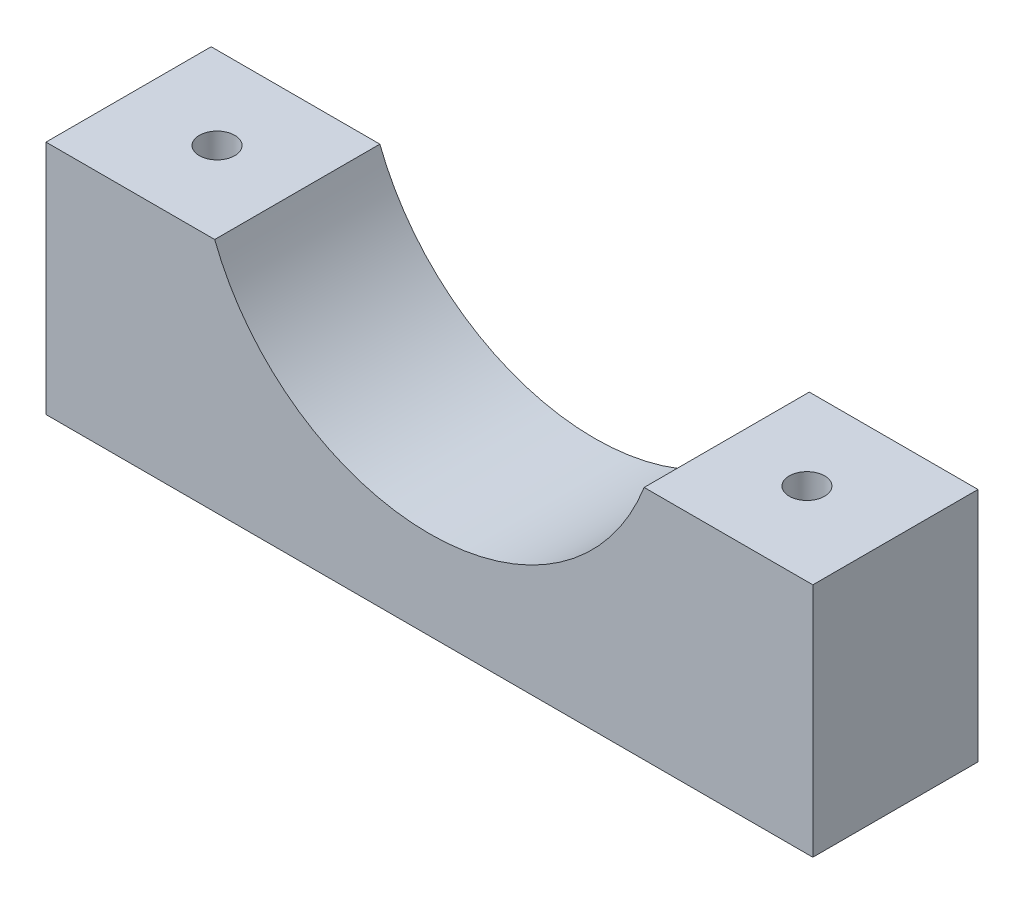
ISO-10303-21;
HEADER;
FILE_DESCRIPTION(('STEP AP214'),'2;1');
FILE_NAME('part.step','',(''),(''),'','','');
FILE_SCHEMA(('AUTOMOTIVE_DESIGN { 1 0 10303 214 1 1 1 1 }'));
ENDSEC;
DATA;
#1=APPLICATION_CONTEXT('core data for automotive mechanical design processes');
#2=APPLICATION_PROTOCOL_DEFINITION('international standard','automotive_design',2000,#1);
#3=PRODUCT_CONTEXT('',#1,'mechanical');
#4=PRODUCT('Part','Part','',(#3));
#5=PRODUCT_RELATED_PRODUCT_CATEGORY('part','',(#4));
#6=PRODUCT_DEFINITION_FORMATION('','',#4);
#7=PRODUCT_DEFINITION_CONTEXT('part definition',#1,'design');
#8=PRODUCT_DEFINITION('design','',#6,#7);
#9=PRODUCT_DEFINITION_SHAPE('','',#8);
#10=(LENGTH_UNIT() NAMED_UNIT(*) SI_UNIT(.MILLI.,.METRE.));
#11=(NAMED_UNIT(*) PLANE_ANGLE_UNIT() SI_UNIT($,.RADIAN.));
#12=(NAMED_UNIT(*) SI_UNIT($,.STERADIAN.) SOLID_ANGLE_UNIT());
#13=UNCERTAINTY_MEASURE_WITH_UNIT(LENGTH_MEASURE(1.E-05),#10,'distance_accuracy_value','');
#14=(GEOMETRIC_REPRESENTATION_CONTEXT(3) GLOBAL_UNCERTAINTY_ASSIGNED_CONTEXT((#13)) GLOBAL_UNIT_ASSIGNED_CONTEXT((#10,
#11,#12)) REPRESENTATION_CONTEXT('',''));
#15=CARTESIAN_POINT('',(0.,0.,0.));
#16=DIRECTION('',(0.,0.,1.));
#17=DIRECTION('',(1.,0.,0.));
#18=AXIS2_PLACEMENT_3D('',#15,#16,#17);
#19=CARTESIAN_POINT('',(0.,20.,0.));
#20=DIRECTION('',(0.,-1.,0.));
#21=DIRECTION('',(0.,0.,-1.));
#22=AXIS2_PLACEMENT_3D('',#19,#20,#21);
#23=PLANE('',#22);
#24=CARTESIAN_POINT('',(57.5,20.,-7.));
#25=DIRECTION('',(0.,-1.,0.));
#26=DIRECTION('',(0.,0.,-1.));
#27=AXIS2_PLACEMENT_3D('',#24,#25,#26);
#28=CIRCLE('',#27,1.50000000000001);
#29=CARTESIAN_POINT('',(57.5,20.,-8.50000000000001));
#30=VERTEX_POINT('',#29);
#31=EDGE_CURVE('E203',#30,#30,#28,.T.);
#32=ORIENTED_EDGE('',*,*,#31,.T.);
#33=EDGE_LOOP('',(#32));
#34=FACE_BOUND('',#33,.T.);
#35=DIRECTION('',(-1.,0.,0.));
#36=VECTOR('',#35,1.);
#37=CARTESIAN_POINT('',(0.,20.,-14.));
#38=LINE('',#37,#36);
#39=CARTESIAN_POINT('',(65.,20.,-14.));
#40=VERTEX_POINT('',#39);
#41=CARTESIAN_POINT('',(50.7002747232013,20.,-14.));
#42=VERTEX_POINT('',#41);
#43=EDGE_CURVE('E108',#40,#42,#38,.T.);
#44=ORIENTED_EDGE('',*,*,#43,.T.);
#45=DIRECTION('',(0.,0.,1.));
#46=VECTOR('',#45,1.);
#47=CARTESIAN_POINT('',(50.7002747232013,20.,-69.1543289325507));
#48=LINE('',#47,#46);
#49=CARTESIAN_POINT('',(50.7002747232013,20.,0.));
#50=VERTEX_POINT('',#49);
#51=EDGE_CURVE('E11',#42,#50,#48,.T.);
#52=ORIENTED_EDGE('',*,*,#51,.T.);
#53=DIRECTION('',(1.,0.,0.));
#54=VECTOR('',#53,1.);
#55=CARTESIAN_POINT('',(0.,20.,0.));
#56=LINE('',#55,#54);
#57=CARTESIAN_POINT('',(65.,20.,0.));
#58=VERTEX_POINT('',#57);
#59=EDGE_CURVE('E149',#50,#58,#56,.T.);
#60=ORIENTED_EDGE('',*,*,#59,.T.);
#61=DIRECTION('',(0.,0.,-1.));
#62=VECTOR('',#61,1.);
#63=CARTESIAN_POINT('',(65.,20.,0.));
#64=LINE('',#63,#62);
#65=EDGE_CURVE('E113',#58,#40,#64,.T.);
#66=ORIENTED_EDGE('',*,*,#65,.T.);
#67=EDGE_LOOP('',(#44,#52,#60,#66));
#68=FACE_BOUND('',#67,.T.);
#69=ADVANCED_FACE('F39',(#34,#68),#23,.F.);
#70=CARTESIAN_POINT('',(0.,20.,0.));
#71=DIRECTION('',(1.,0.,0.));
#72=DIRECTION('',(0.,0.,-1.));
#73=AXIS2_PLACEMENT_3D('',#70,#71,#72);
#74=PLANE('',#73);
#75=DIRECTION('',(0.,0.,1.));
#76=VECTOR('',#75,1.);
#77=CARTESIAN_POINT('',(0.,0.,0.));
#78=LINE('',#77,#76);
#79=CARTESIAN_POINT('',(0.,0.,-14.));
#80=VERTEX_POINT('',#79);
#81=CARTESIAN_POINT('',(0.,0.,0.));
#82=VERTEX_POINT('',#81);
#83=EDGE_CURVE('E110',#80,#82,#78,.T.);
#84=ORIENTED_EDGE('',*,*,#83,.T.);
#85=DIRECTION('',(0.,-1.,0.));
#86=VECTOR('',#85,1.);
#87=CARTESIAN_POINT('',(0.,20.,0.));
#88=LINE('',#87,#86);
#89=CARTESIAN_POINT('',(0.,20.,0.));
#90=VERTEX_POINT('',#89);
#91=EDGE_CURVE('E143',#90,#82,#88,.T.);
#92=ORIENTED_EDGE('',*,*,#91,.F.);
#93=DIRECTION('',(0.,0.,1.));
#94=VECTOR('',#93,1.);
#95=CARTESIAN_POINT('',(0.,20.,0.));
#96=LINE('',#95,#94);
#97=CARTESIAN_POINT('',(0.,20.,-14.));
#98=VERTEX_POINT('',#97);
#99=EDGE_CURVE('E135',#98,#90,#96,.T.);
#100=ORIENTED_EDGE('',*,*,#99,.F.);
#101=DIRECTION('',(0.,-1.,0.));
#102=VECTOR('',#101,1.);
#103=CARTESIAN_POINT('',(0.,20.,-14.));
#104=LINE('',#103,#102);
#105=EDGE_CURVE('E116',#98,#80,#104,.T.);
#106=ORIENTED_EDGE('',*,*,#105,.T.);
#107=EDGE_LOOP('',(#84,#92,#100,#106));
#108=FACE_BOUND('',#107,.T.);
#109=ADVANCED_FACE('F41',(#108),#74,.F.);
#110=CARTESIAN_POINT('',(0.,20.,0.));
#111=DIRECTION('',(0.,0.,-1.));
#112=DIRECTION('',(-1.,0.,0.));
#113=AXIS2_PLACEMENT_3D('',#110,#111,#112);
#114=PLANE('',#113);
#115=ORIENTED_EDGE('',*,*,#59,.F.);
#116=CARTESIAN_POINT('',(32.5,27.,0.));
#117=DIRECTION('',(0.,0.,1.));
#118=DIRECTION('',(1.,0.,0.));
#119=AXIS2_PLACEMENT_3D('',#116,#117,#118);
#120=CIRCLE('',#119,19.5);
#121=CARTESIAN_POINT('',(14.2997252767987,20.,0.));
#122=VERTEX_POINT('',#121);
#123=EDGE_CURVE('E102',#122,#50,#120,.T.);
#124=ORIENTED_EDGE('',*,*,#123,.F.);
#125=EDGE_CURVE('E93',#90,#122,#56,.T.);
#126=ORIENTED_EDGE('',*,*,#125,.F.);
#127=ORIENTED_EDGE('',*,*,#91,.T.);
#128=DIRECTION('',(1.,0.,0.));
#129=VECTOR('',#128,1.);
#130=CARTESIAN_POINT('',(0.,0.,0.));
#131=LINE('',#130,#129);
#132=CARTESIAN_POINT('',(65.,0.,0.));
#133=VERTEX_POINT('',#132);
#134=EDGE_CURVE('E128',#82,#133,#131,.T.);
#135=ORIENTED_EDGE('',*,*,#134,.T.);
#136=DIRECTION('',(0.,-1.,0.));
#137=VECTOR('',#136,1.);
#138=CARTESIAN_POINT('',(65.,20.,0.));
#139=LINE('',#138,#137);
#140=EDGE_CURVE('E139',#58,#133,#139,.T.);
#141=ORIENTED_EDGE('',*,*,#140,.F.);
#142=EDGE_LOOP('',(#115,#124,#126,#127,#135,#141));
#143=FACE_BOUND('',#142,.T.);
#144=ADVANCED_FACE('F147',(#143),#114,.F.);
#145=CARTESIAN_POINT('',(65.,20.,0.));
#146=DIRECTION('',(-1.,0.,0.));
#147=DIRECTION('',(0.,0.,1.));
#148=AXIS2_PLACEMENT_3D('',#145,#146,#147);
#149=PLANE('',#148);
#150=DIRECTION('',(0.,0.,-1.));
#151=VECTOR('',#150,1.);
#152=CARTESIAN_POINT('',(65.,0.,0.));
#153=LINE('',#152,#151);
#154=CARTESIAN_POINT('',(65.,0.,-14.));
#155=VERTEX_POINT('',#154);
#156=EDGE_CURVE('E131',#133,#155,#153,.T.);
#157=ORIENTED_EDGE('',*,*,#156,.T.);
#158=DIRECTION('',(0.,-1.,0.));
#159=VECTOR('',#158,1.);
#160=CARTESIAN_POINT('',(65.,20.,-14.));
#161=LINE('',#160,#159);
#162=EDGE_CURVE('E120',#40,#155,#161,.T.);
#163=ORIENTED_EDGE('',*,*,#162,.F.);
#164=ORIENTED_EDGE('',*,*,#65,.F.);
#165=ORIENTED_EDGE('',*,*,#140,.T.);
#166=EDGE_LOOP('',(#157,#163,#164,#165));
#167=FACE_BOUND('',#166,.T.);
#168=ADVANCED_FACE('F165',(#167),#149,.F.);
#169=CARTESIAN_POINT('',(0.,20.,-14.));
#170=DIRECTION('',(0.,0.,1.));
#171=DIRECTION('',(1.,0.,0.));
#172=AXIS2_PLACEMENT_3D('',#169,#170,#171);
#173=PLANE('',#172);
#174=CARTESIAN_POINT('',(14.2997252767987,20.,-14.));
#175=VERTEX_POINT('',#174);
#176=EDGE_CURVE('E63',#175,#98,#38,.T.);
#177=ORIENTED_EDGE('',*,*,#176,.F.);
#178=CARTESIAN_POINT('',(32.5,27.,-14.));
#179=DIRECTION('',(0.,0.,1.));
#180=DIRECTION('',(1.,0.,0.));
#181=AXIS2_PLACEMENT_3D('',#178,#179,#180);
#182=CIRCLE('',#181,19.5);
#183=EDGE_CURVE('E55',#42,#175,#182,.F.);
#184=ORIENTED_EDGE('',*,*,#183,.F.);
#185=ORIENTED_EDGE('',*,*,#43,.F.);
#186=ORIENTED_EDGE('',*,*,#162,.T.);
#187=DIRECTION('',(-1.,0.,0.));
#188=VECTOR('',#187,1.);
#189=CARTESIAN_POINT('',(0.,0.,-14.));
#190=LINE('',#189,#188);
#191=EDGE_CURVE('E85',#155,#80,#190,.T.);
#192=ORIENTED_EDGE('',*,*,#191,.T.);
#193=ORIENTED_EDGE('',*,*,#105,.F.);
#194=EDGE_LOOP('',(#177,#184,#185,#186,#192,#193));
#195=FACE_BOUND('',#194,.T.);
#196=ADVANCED_FACE('F107',(#195),#173,.F.);
#197=CARTESIAN_POINT('',(7.5,20.,-7.));
#198=DIRECTION('',(0.,-1.,0.));
#199=DIRECTION('',(0.,0.,-1.));
#200=AXIS2_PLACEMENT_3D('',#197,#198,#199);
#201=CIRCLE('',#200,1.50000000000001);
#202=CARTESIAN_POINT('',(7.5,20.,-8.50000000000001));
#203=VERTEX_POINT('',#202);
#204=EDGE_CURVE('E151',#203,#203,#201,.T.);
#205=ORIENTED_EDGE('',*,*,#204,.T.);
#206=EDGE_LOOP('',(#205));
#207=FACE_BOUND('',#206,.T.);
#208=ORIENTED_EDGE('',*,*,#125,.T.);
#209=DIRECTION('',(0.,0.,1.));
#210=VECTOR('',#209,1.);
#211=CARTESIAN_POINT('',(14.2997252767987,20.,-69.1543289325507));
#212=LINE('',#211,#210);
#213=EDGE_CURVE('E48',#122,#175,#212,.F.);
#214=ORIENTED_EDGE('',*,*,#213,.T.);
#215=ORIENTED_EDGE('',*,*,#176,.T.);
#216=ORIENTED_EDGE('',*,*,#99,.T.);
#217=EDGE_LOOP('',(#208,#214,#215,#216));
#218=FACE_BOUND('',#217,.T.);
#219=ADVANCED_FACE('F146',(#207,#218),#23,.F.);
#220=CARTESIAN_POINT('',(0.,0.,0.));
#221=DIRECTION('',(0.,-1.,0.));
#222=DIRECTION('',(0.,0.,-1.));
#223=AXIS2_PLACEMENT_3D('',#220,#221,#222);
#224=PLANE('',#223);
#225=CARTESIAN_POINT('',(57.5,0.,-7.));
#226=DIRECTION('',(0.,-1.,0.));
#227=DIRECTION('',(0.,0.,-1.));
#228=AXIS2_PLACEMENT_3D('',#225,#226,#227);
#229=CIRCLE('',#228,1.50000000000002);
#230=CARTESIAN_POINT('',(57.5,0.,-8.50000000000001));
#231=VERTEX_POINT('',#230);
#232=EDGE_CURVE('E205',#231,#231,#229,.T.);
#233=ORIENTED_EDGE('',*,*,#232,.F.);
#234=EDGE_LOOP('',(#233));
#235=FACE_BOUND('',#234,.T.);
#236=CARTESIAN_POINT('',(7.5,0.,-7.));
#237=DIRECTION('',(0.,-1.,0.));
#238=DIRECTION('',(0.,0.,-1.));
#239=AXIS2_PLACEMENT_3D('',#236,#237,#238);
#240=CIRCLE('',#239,1.50000000000001);
#241=CARTESIAN_POINT('',(7.5,0.,-8.50000000000001));
#242=VERTEX_POINT('',#241);
#243=EDGE_CURVE('E155',#242,#242,#240,.T.);
#244=ORIENTED_EDGE('',*,*,#243,.F.);
#245=EDGE_LOOP('',(#244));
#246=FACE_BOUND('',#245,.T.);
#247=ORIENTED_EDGE('',*,*,#83,.F.);
#248=ORIENTED_EDGE('',*,*,#191,.F.);
#249=ORIENTED_EDGE('',*,*,#156,.F.);
#250=ORIENTED_EDGE('',*,*,#134,.F.);
#251=EDGE_LOOP('',(#247,#248,#249,#250));
#252=FACE_BOUND('',#251,.T.);
#253=ADVANCED_FACE('F168',(#235,#246,#252),#224,.T.);
#254=CARTESIAN_POINT('',(32.5,27.,-69.1543289325507));
#255=DIRECTION('',(0.,0.,1.));
#256=DIRECTION('',(1.,0.,0.));
#257=AXIS2_PLACEMENT_3D('',#254,#255,#256);
#258=CYLINDRICAL_SURFACE('',#257,19.5);
#259=ORIENTED_EDGE('',*,*,#183,.T.);
#260=ORIENTED_EDGE('',*,*,#213,.F.);
#261=ORIENTED_EDGE('',*,*,#123,.T.);
#262=ORIENTED_EDGE('',*,*,#51,.F.);
#263=EDGE_LOOP('',(#259,#260,#261,#262));
#264=FACE_BOUND('',#263,.T.);
#265=ADVANCED_FACE('F101',(#264),#258,.F.);
#266=CARTESIAN_POINT('',(7.5,0.,-7.));
#267=DIRECTION('',(0.,-1.,0.));
#268=DIRECTION('',(0.,0.,-1.));
#269=AXIS2_PLACEMENT_3D('',#266,#267,#268);
#270=CYLINDRICAL_SURFACE('',#269,1.50000000000001);
#271=ORIENTED_EDGE('',*,*,#204,.F.);
#272=EDGE_LOOP('',(#271));
#273=FACE_BOUND('',#272,.T.);
#274=ORIENTED_EDGE('',*,*,#243,.T.);
#275=EDGE_LOOP('',(#274));
#276=FACE_BOUND('',#275,.T.);
#277=ADVANCED_FACE('F194',(#273,#276),#270,.F.);
#278=CARTESIAN_POINT('',(57.5,0.,-7.));
#279=DIRECTION('',(0.,-1.,0.));
#280=DIRECTION('',(0.,0.,-1.));
#281=AXIS2_PLACEMENT_3D('',#278,#279,#280);
#282=CYLINDRICAL_SURFACE('',#281,1.50000000000001);
#283=ORIENTED_EDGE('',*,*,#31,.F.);
#284=EDGE_LOOP('',(#283));
#285=FACE_BOUND('',#284,.T.);
#286=ORIENTED_EDGE('',*,*,#232,.T.);
#287=EDGE_LOOP('',(#286));
#288=FACE_BOUND('',#287,.T.);
#289=ADVANCED_FACE('F197',(#285,#288),#282,.F.);
#290=CLOSED_SHELL('',(#69,#109,#144,#168,#196,#219,#253,#265,#277,#289));
#291=MANIFOLD_SOLID_BREP('B2',#290);
#292=ADVANCED_BREP_SHAPE_REPRESENTATION('',(#18,#291),#14);
#293=SHAPE_DEFINITION_REPRESENTATION(#9,#292);
ENDSEC;
END-ISO-10303-21;
